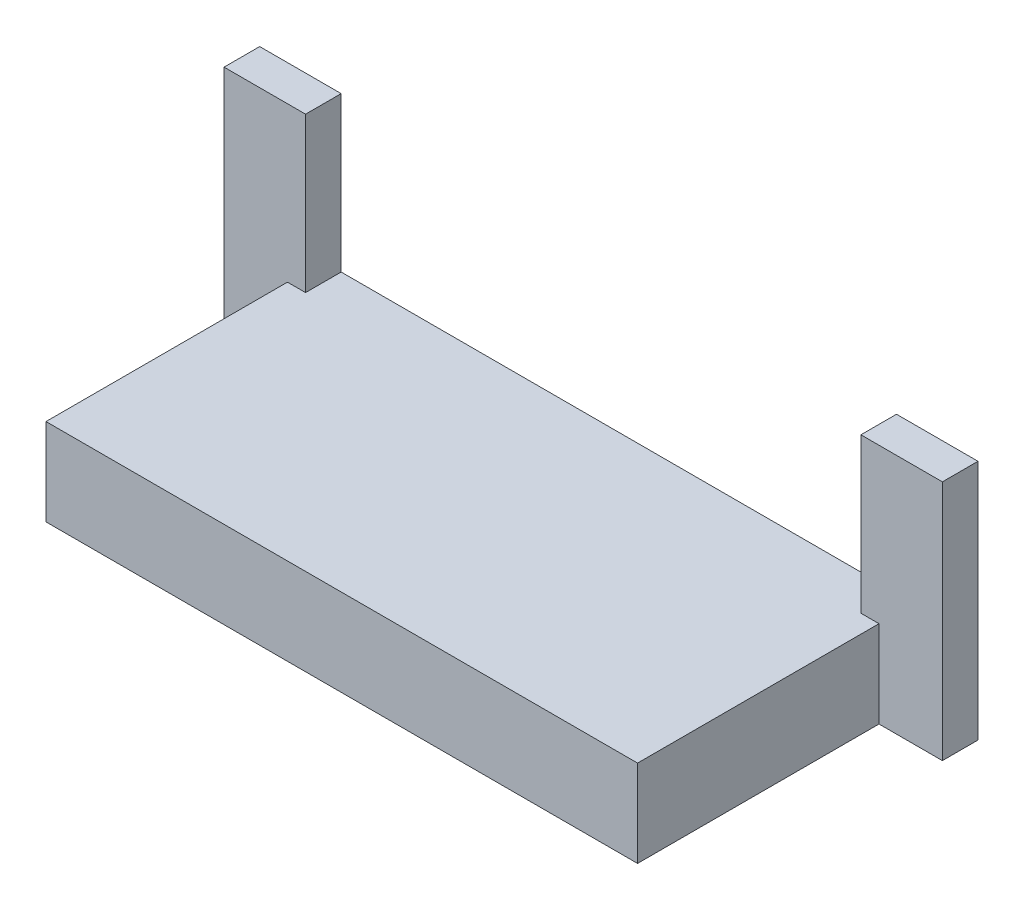
ISO-10303-21;
HEADER;
FILE_DESCRIPTION(('STEP AP214'),'2;1');
FILE_NAME('part.step','',(''),(''),'','','');
FILE_SCHEMA(('AUTOMOTIVE_DESIGN { 1 0 10303 214 1 1 1 1 }'));
ENDSEC;
DATA;
#1=APPLICATION_CONTEXT('core data for automotive mechanical design processes');
#2=APPLICATION_PROTOCOL_DEFINITION('international standard','automotive_design',2000,#1);
#3=PRODUCT_CONTEXT('',#1,'mechanical');
#4=PRODUCT('Part','Part','',(#3));
#5=PRODUCT_RELATED_PRODUCT_CATEGORY('part','',(#4));
#6=PRODUCT_DEFINITION_FORMATION('','',#4);
#7=PRODUCT_DEFINITION_CONTEXT('part definition',#1,'design');
#8=PRODUCT_DEFINITION('design','',#6,#7);
#9=PRODUCT_DEFINITION_SHAPE('','',#8);
#10=(LENGTH_UNIT() NAMED_UNIT(*) SI_UNIT(.MILLI.,.METRE.));
#11=(NAMED_UNIT(*) PLANE_ANGLE_UNIT() SI_UNIT($,.RADIAN.));
#12=(NAMED_UNIT(*) SI_UNIT($,.STERADIAN.) SOLID_ANGLE_UNIT());
#13=UNCERTAINTY_MEASURE_WITH_UNIT(LENGTH_MEASURE(1.E-05),#10,'distance_accuracy_value','');
#14=(GEOMETRIC_REPRESENTATION_CONTEXT(3) GLOBAL_UNCERTAINTY_ASSIGNED_CONTEXT((#13)) GLOBAL_UNIT_ASSIGNED_CONTEXT((#10,
#11,#12)) REPRESENTATION_CONTEXT('',''));
#15=CARTESIAN_POINT('',(0.,0.,0.));
#16=DIRECTION('',(0.,0.,1.));
#17=DIRECTION('',(1.,0.,0.));
#18=AXIS2_PLACEMENT_3D('',#15,#16,#17);
#19=CARTESIAN_POINT('',(0.,0.,1.475));
#20=DIRECTION('',(0.,0.,1.));
#21=DIRECTION('',(1.,0.,0.));
#22=AXIS2_PLACEMENT_3D('',#19,#20,#21);
#23=PLANE('',#22);
#24=DIRECTION('',(0.,-1.,0.));
#25=VECTOR('',#24,1.);
#26=CARTESIAN_POINT('',(-24.5,-2.8,1.475));
#27=LINE('',#26,#25);
#28=CARTESIAN_POINT('',(-24.5,-2.8,1.475));
#29=VERTEX_POINT('',#28);
#30=CARTESIAN_POINT('',(-24.5,-10.,1.475));
#31=VERTEX_POINT('',#30);
#32=EDGE_CURVE('E50',#29,#31,#27,.T.);
#33=ORIENTED_EDGE('',*,*,#32,.F.);
#34=DIRECTION('',(-1.,0.,0.));
#35=VECTOR('',#34,1.);
#36=CARTESIAN_POINT('',(-23.,-2.8,1.475));
#37=LINE('',#36,#35);
#38=CARTESIAN_POINT('',(-23.,-2.8,1.475));
#39=VERTEX_POINT('',#38);
#40=EDGE_CURVE('E11',#39,#29,#37,.T.);
#41=ORIENTED_EDGE('',*,*,#40,.F.);
#42=DIRECTION('',(0.,1.,0.));
#43=VECTOR('',#42,1.);
#44=CARTESIAN_POINT('',(-23.,-2.8,1.475));
#45=LINE('',#44,#43);
#46=CARTESIAN_POINT('',(-23.,10.,1.475));
#47=VERTEX_POINT('',#46);
#48=EDGE_CURVE('E163',#39,#47,#45,.T.);
#49=ORIENTED_EDGE('',*,*,#48,.T.);
#50=DIRECTION('',(-1.,0.,0.));
#51=VECTOR('',#50,1.);
#52=CARTESIAN_POINT('',(-29.75,10.,1.475));
#53=LINE('',#52,#51);
#54=CARTESIAN_POINT('',(-29.75,10.,1.475));
#55=VERTEX_POINT('',#54);
#56=EDGE_CURVE('E165',#47,#55,#53,.T.);
#57=ORIENTED_EDGE('',*,*,#56,.T.);
#58=DIRECTION('',(0.,-1.,0.));
#59=VECTOR('',#58,1.);
#60=CARTESIAN_POINT('',(-29.75,10.,1.475));
#61=LINE('',#60,#59);
#62=CARTESIAN_POINT('',(-29.75,-10.,1.475));
#63=VERTEX_POINT('',#62);
#64=EDGE_CURVE('E167',#55,#63,#61,.T.);
#65=ORIENTED_EDGE('',*,*,#64,.T.);
#66=DIRECTION('',(1.,0.,0.));
#67=VECTOR('',#66,1.);
#68=CARTESIAN_POINT('',(-29.75,-10.,1.475));
#69=LINE('',#68,#67);
#70=EDGE_CURVE('E170',#63,#31,#69,.T.);
#71=ORIENTED_EDGE('',*,*,#70,.T.);
#72=EDGE_LOOP('',(#33,#41,#49,#57,#65,#71));
#73=FACE_BOUND('',#72,.T.);
#74=ADVANCED_FACE('F33',(#73),#23,.T.);
#75=CARTESIAN_POINT('',(29.75,10.,1.475));
#76=DIRECTION('',(-1.,0.,0.));
#77=DIRECTION('',(0.,-1.,0.));
#78=AXIS2_PLACEMENT_3D('',#75,#76,#77);
#79=PLANE('',#78);
#80=DIRECTION('',(0.,1.,0.));
#81=VECTOR('',#80,1.);
#82=CARTESIAN_POINT('',(29.75,10.,-1.475));
#83=LINE('',#82,#81);
#84=CARTESIAN_POINT('',(29.75,-10.,-1.475));
#85=VERTEX_POINT('',#84);
#86=CARTESIAN_POINT('',(29.75,10.,-1.475));
#87=VERTEX_POINT('',#86);
#88=EDGE_CURVE('E146',#85,#87,#83,.T.);
#89=ORIENTED_EDGE('',*,*,#88,.T.);
#90=DIRECTION('',(0.,0.,-1.));
#91=VECTOR('',#90,1.);
#92=CARTESIAN_POINT('',(29.75,10.,1.475));
#93=LINE('',#92,#91);
#94=CARTESIAN_POINT('',(29.75,10.,1.475));
#95=VERTEX_POINT('',#94);
#96=EDGE_CURVE('E37',#95,#87,#93,.T.);
#97=ORIENTED_EDGE('',*,*,#96,.F.);
#98=DIRECTION('',(0.,1.,0.));
#99=VECTOR('',#98,1.);
#100=CARTESIAN_POINT('',(29.75,10.,1.475));
#101=LINE('',#100,#99);
#102=CARTESIAN_POINT('',(29.75,-10.,1.475));
#103=VERTEX_POINT('',#102);
#104=EDGE_CURVE('E155',#103,#95,#101,.T.);
#105=ORIENTED_EDGE('',*,*,#104,.F.);
#106=DIRECTION('',(0.,0.,-1.));
#107=VECTOR('',#106,1.);
#108=CARTESIAN_POINT('',(29.75,-10.,1.475));
#109=LINE('',#108,#107);
#110=EDGE_CURVE('E171',#103,#85,#109,.T.);
#111=ORIENTED_EDGE('',*,*,#110,.T.);
#112=EDGE_LOOP('',(#89,#97,#105,#111));
#113=FACE_BOUND('',#112,.T.);
#114=ADVANCED_FACE('F35',(#113),#79,.F.);
#115=CARTESIAN_POINT('',(23.,10.,1.475));
#116=DIRECTION('',(0.,-1.,0.));
#117=DIRECTION('',(0.,0.,-1.));
#118=AXIS2_PLACEMENT_3D('',#115,#116,#117);
#119=PLANE('',#118);
#120=DIRECTION('',(-1.,0.,0.));
#121=VECTOR('',#120,1.);
#122=CARTESIAN_POINT('',(23.,10.,-1.475));
#123=LINE('',#122,#121);
#124=CARTESIAN_POINT('',(23.,10.,-1.475));
#125=VERTEX_POINT('',#124);
#126=EDGE_CURVE('E149',#87,#125,#123,.T.);
#127=ORIENTED_EDGE('',*,*,#126,.T.);
#128=DIRECTION('',(0.,0.,-1.));
#129=VECTOR('',#128,1.);
#130=CARTESIAN_POINT('',(23.,10.,1.475));
#131=LINE('',#130,#129);
#132=CARTESIAN_POINT('',(23.,10.,1.475));
#133=VERTEX_POINT('',#132);
#134=EDGE_CURVE('E202',#133,#125,#131,.T.);
#135=ORIENTED_EDGE('',*,*,#134,.F.);
#136=DIRECTION('',(-1.,0.,0.));
#137=VECTOR('',#136,1.);
#138=CARTESIAN_POINT('',(23.,10.,1.475));
#139=LINE('',#138,#137);
#140=EDGE_CURVE('E158',#95,#133,#139,.T.);
#141=ORIENTED_EDGE('',*,*,#140,.F.);
#142=ORIENTED_EDGE('',*,*,#96,.T.);
#143=EDGE_LOOP('',(#127,#135,#141,#142));
#144=FACE_BOUND('',#143,.T.);
#145=ADVANCED_FACE('F210',(#144),#119,.F.);
#146=CARTESIAN_POINT('',(23.,-2.8,1.475));
#147=DIRECTION('',(1.,0.,0.));
#148=DIRECTION('',(0.,0.,-1.));
#149=AXIS2_PLACEMENT_3D('',#146,#147,#148);
#150=PLANE('',#149);
#151=DIRECTION('',(0.,-1.,0.));
#152=VECTOR('',#151,1.);
#153=CARTESIAN_POINT('',(23.,-2.8,-1.475));
#154=LINE('',#153,#152);
#155=CARTESIAN_POINT('',(23.,-2.8,-1.475));
#156=VERTEX_POINT('',#155);
#157=EDGE_CURVE('E175',#125,#156,#154,.T.);
#158=ORIENTED_EDGE('',*,*,#157,.T.);
#159=DIRECTION('',(0.,0.,-1.));
#160=VECTOR('',#159,1.);
#161=CARTESIAN_POINT('',(23.,-2.8,1.475));
#162=LINE('',#161,#160);
#163=CARTESIAN_POINT('',(23.,-2.8,1.475));
#164=VERTEX_POINT('',#163);
#165=EDGE_CURVE('E200',#164,#156,#162,.T.);
#166=ORIENTED_EDGE('',*,*,#165,.F.);
#167=DIRECTION('',(0.,-1.,0.));
#168=VECTOR('',#167,1.);
#169=CARTESIAN_POINT('',(23.,10.,1.475));
#170=LINE('',#169,#168);
#171=EDGE_CURVE('E161',#133,#164,#170,.T.);
#172=ORIENTED_EDGE('',*,*,#171,.F.);
#173=ORIENTED_EDGE('',*,*,#134,.T.);
#174=EDGE_LOOP('',(#158,#166,#172,#173));
#175=FACE_BOUND('',#174,.T.);
#176=ADVANCED_FACE('F221',(#175),#150,.F.);
#177=CARTESIAN_POINT('',(-23.,-2.8,1.475));
#178=DIRECTION('',(0.,-1.,0.));
#179=DIRECTION('',(0.,0.,-1.));
#180=AXIS2_PLACEMENT_3D('',#177,#178,#179);
#181=PLANE('',#180);
#182=DIRECTION('',(-1.,0.,0.));
#183=VECTOR('',#182,1.);
#184=CARTESIAN_POINT('',(-23.,-2.8,-1.475));
#185=LINE('',#184,#183);
#186=CARTESIAN_POINT('',(-23.,-2.8,-1.475));
#187=VERTEX_POINT('',#186);
#188=EDGE_CURVE('E177',#156,#187,#185,.T.);
#189=ORIENTED_EDGE('',*,*,#188,.T.);
#190=DIRECTION('',(0.,0.,-1.));
#191=VECTOR('',#190,1.);
#192=CARTESIAN_POINT('',(-23.,-2.8,1.475));
#193=LINE('',#192,#191);
#194=EDGE_CURVE('E197',#39,#187,#193,.T.);
#195=ORIENTED_EDGE('',*,*,#194,.F.);
#196=ORIENTED_EDGE('',*,*,#40,.T.);
#197=DIRECTION('',(0.,0.,-1.));
#198=VECTOR('',#197,1.);
#199=CARTESIAN_POINT('',(-24.5,-2.8,21.475));
#200=LINE('',#199,#198);
#201=CARTESIAN_POINT('',(-24.5,-2.8,21.475));
#202=VERTEX_POINT('',#201);
#203=EDGE_CURVE('E127',#202,#29,#200,.T.);
#204=ORIENTED_EDGE('',*,*,#203,.F.);
#205=DIRECTION('',(-1.,0.,0.));
#206=VECTOR('',#205,1.);
#207=CARTESIAN_POINT('',(-23.,-2.8,21.475));
#208=LINE('',#207,#206);
#209=CARTESIAN_POINT('',(24.5,-2.79999999999999,21.475));
#210=VERTEX_POINT('',#209);
#211=EDGE_CURVE('E133',#210,#202,#208,.T.);
#212=ORIENTED_EDGE('',*,*,#211,.F.);
#213=DIRECTION('',(0.,0.,-1.));
#214=VECTOR('',#213,1.);
#215=CARTESIAN_POINT('',(24.5,-2.79999999999999,21.475));
#216=LINE('',#215,#214);
#217=CARTESIAN_POINT('',(24.5,-2.79999999999999,1.475));
#218=VERTEX_POINT('',#217);
#219=EDGE_CURVE('E223',#210,#218,#216,.T.);
#220=ORIENTED_EDGE('',*,*,#219,.T.);
#221=EDGE_CURVE('E43',#218,#164,#37,.T.);
#222=ORIENTED_EDGE('',*,*,#221,.T.);
#223=ORIENTED_EDGE('',*,*,#165,.T.);
#224=EDGE_LOOP('',(#189,#195,#196,#204,#212,#220,#222,#223));
#225=FACE_BOUND('',#224,.T.);
#226=ADVANCED_FACE('F144',(#225),#181,.F.);
#227=CARTESIAN_POINT('',(-23.,10.,1.475));
#228=DIRECTION('',(-1.,0.,0.));
#229=DIRECTION('',(0.,0.,1.));
#230=AXIS2_PLACEMENT_3D('',#227,#228,#229);
#231=PLANE('',#230);
#232=DIRECTION('',(0.,1.,0.));
#233=VECTOR('',#232,1.);
#234=CARTESIAN_POINT('',(-23.,10.,-1.475));
#235=LINE('',#234,#233);
#236=CARTESIAN_POINT('',(-23.,10.,-1.475));
#237=VERTEX_POINT('',#236);
#238=EDGE_CURVE('E179',#187,#237,#235,.T.);
#239=ORIENTED_EDGE('',*,*,#238,.T.);
#240=DIRECTION('',(0.,0.,-1.));
#241=VECTOR('',#240,1.);
#242=CARTESIAN_POINT('',(-23.,10.,1.475));
#243=LINE('',#242,#241);
#244=EDGE_CURVE('E194',#47,#237,#243,.T.);
#245=ORIENTED_EDGE('',*,*,#244,.F.);
#246=ORIENTED_EDGE('',*,*,#48,.F.);
#247=ORIENTED_EDGE('',*,*,#194,.T.);
#248=EDGE_LOOP('',(#239,#245,#246,#247));
#249=FACE_BOUND('',#248,.T.);
#250=ADVANCED_FACE('F258',(#249),#231,.F.);
#251=CARTESIAN_POINT('',(-29.75,10.,1.475));
#252=DIRECTION('',(0.,-1.,0.));
#253=DIRECTION('',(0.,0.,-1.));
#254=AXIS2_PLACEMENT_3D('',#251,#252,#253);
#255=PLANE('',#254);
#256=DIRECTION('',(-1.,0.,0.));
#257=VECTOR('',#256,1.);
#258=CARTESIAN_POINT('',(-29.75,10.,-1.475));
#259=LINE('',#258,#257);
#260=CARTESIAN_POINT('',(-29.75,10.,-1.475));
#261=VERTEX_POINT('',#260);
#262=EDGE_CURVE('E181',#237,#261,#259,.T.);
#263=ORIENTED_EDGE('',*,*,#262,.T.);
#264=DIRECTION('',(0.,0.,-1.));
#265=VECTOR('',#264,1.);
#266=CARTESIAN_POINT('',(-29.75,10.,1.475));
#267=LINE('',#266,#265);
#268=EDGE_CURVE('E191',#55,#261,#267,.T.);
#269=ORIENTED_EDGE('',*,*,#268,.F.);
#270=ORIENTED_EDGE('',*,*,#56,.F.);
#271=ORIENTED_EDGE('',*,*,#244,.T.);
#272=EDGE_LOOP('',(#263,#269,#270,#271));
#273=FACE_BOUND('',#272,.T.);
#274=ADVANCED_FACE('F261',(#273),#255,.F.);
#275=CARTESIAN_POINT('',(-29.75,10.,1.475));
#276=DIRECTION('',(1.,0.,0.));
#277=DIRECTION('',(0.,1.,0.));
#278=AXIS2_PLACEMENT_3D('',#275,#276,#277);
#279=PLANE('',#278);
#280=DIRECTION('',(0.,-1.,0.));
#281=VECTOR('',#280,1.);
#282=CARTESIAN_POINT('',(-29.75,10.,-1.475));
#283=LINE('',#282,#281);
#284=CARTESIAN_POINT('',(-29.75,-10.,-1.475));
#285=VERTEX_POINT('',#284);
#286=EDGE_CURVE('E183',#261,#285,#283,.T.);
#287=ORIENTED_EDGE('',*,*,#286,.T.);
#288=DIRECTION('',(0.,0.,-1.));
#289=VECTOR('',#288,1.);
#290=CARTESIAN_POINT('',(-29.75,-10.,1.475));
#291=LINE('',#290,#289);
#292=EDGE_CURVE('E188',#63,#285,#291,.T.);
#293=ORIENTED_EDGE('',*,*,#292,.F.);
#294=ORIENTED_EDGE('',*,*,#64,.F.);
#295=ORIENTED_EDGE('',*,*,#268,.T.);
#296=EDGE_LOOP('',(#287,#293,#294,#295));
#297=FACE_BOUND('',#296,.T.);
#298=ADVANCED_FACE('F241',(#297),#279,.F.);
#299=CARTESIAN_POINT('',(-29.75,-10.,1.475));
#300=DIRECTION('',(0.,1.,0.));
#301=DIRECTION('',(0.,0.,1.));
#302=AXIS2_PLACEMENT_3D('',#299,#300,#301);
#303=PLANE('',#302);
#304=DIRECTION('',(1.,0.,0.));
#305=VECTOR('',#304,1.);
#306=CARTESIAN_POINT('',(-29.75,-10.,-1.475));
#307=LINE('',#306,#305);
#308=EDGE_CURVE('E159',#285,#85,#307,.T.);
#309=ORIENTED_EDGE('',*,*,#308,.T.);
#310=ORIENTED_EDGE('',*,*,#110,.F.);
#311=CARTESIAN_POINT('',(24.5,-10.,1.475));
#312=VERTEX_POINT('',#311);
#313=EDGE_CURVE('E169',#312,#103,#69,.T.);
#314=ORIENTED_EDGE('',*,*,#313,.F.);
#315=DIRECTION('',(0.,0.,-1.));
#316=VECTOR('',#315,1.);
#317=CARTESIAN_POINT('',(24.5,-9.99999999999999,21.475));
#318=LINE('',#317,#316);
#319=CARTESIAN_POINT('',(24.5,-9.99999999999999,21.475));
#320=VERTEX_POINT('',#319);
#321=EDGE_CURVE('E151',#320,#312,#318,.T.);
#322=ORIENTED_EDGE('',*,*,#321,.F.);
#323=DIRECTION('',(1.,0.,0.));
#324=VECTOR('',#323,1.);
#325=CARTESIAN_POINT('',(-24.5,-10.,21.475));
#326=LINE('',#325,#324);
#327=CARTESIAN_POINT('',(-24.5,-10.,21.475));
#328=VERTEX_POINT('',#327);
#329=EDGE_CURVE('E132',#328,#320,#326,.T.);
#330=ORIENTED_EDGE('',*,*,#329,.F.);
#331=DIRECTION('',(0.,0.,-1.));
#332=VECTOR('',#331,1.);
#333=CARTESIAN_POINT('',(-24.5,-10.,21.475));
#334=LINE('',#333,#332);
#335=EDGE_CURVE('E129',#328,#31,#334,.T.);
#336=ORIENTED_EDGE('',*,*,#335,.T.);
#337=ORIENTED_EDGE('',*,*,#70,.F.);
#338=ORIENTED_EDGE('',*,*,#292,.T.);
#339=EDGE_LOOP('',(#309,#310,#314,#322,#330,#336,#337,#338));
#340=FACE_BOUND('',#339,.T.);
#341=ADVANCED_FACE('F232',(#340),#303,.F.);
#342=ORIENTED_EDGE('',*,*,#221,.F.);
#343=DIRECTION('',(0.,1.,0.));
#344=VECTOR('',#343,1.);
#345=CARTESIAN_POINT('',(24.5,-2.79999999999999,1.475));
#346=LINE('',#345,#344);
#347=EDGE_CURVE('E57',#312,#218,#346,.T.);
#348=ORIENTED_EDGE('',*,*,#347,.F.);
#349=ORIENTED_EDGE('',*,*,#313,.T.);
#350=ORIENTED_EDGE('',*,*,#104,.T.);
#351=ORIENTED_EDGE('',*,*,#140,.T.);
#352=ORIENTED_EDGE('',*,*,#171,.T.);
#353=EDGE_LOOP('',(#342,#348,#349,#350,#351,#352));
#354=FACE_BOUND('',#353,.T.);
#355=ADVANCED_FACE('F233',(#354),#23,.T.);
#356=CARTESIAN_POINT('',(0.,0.,-1.475));
#357=DIRECTION('',(0.,0.,1.));
#358=DIRECTION('',(1.,0.,0.));
#359=AXIS2_PLACEMENT_3D('',#356,#357,#358);
#360=PLANE('',#359);
#361=ORIENTED_EDGE('',*,*,#88,.F.);
#362=ORIENTED_EDGE('',*,*,#308,.F.);
#363=ORIENTED_EDGE('',*,*,#286,.F.);
#364=ORIENTED_EDGE('',*,*,#262,.F.);
#365=ORIENTED_EDGE('',*,*,#238,.F.);
#366=ORIENTED_EDGE('',*,*,#188,.F.);
#367=ORIENTED_EDGE('',*,*,#157,.F.);
#368=ORIENTED_EDGE('',*,*,#126,.F.);
#369=EDGE_LOOP('',(#361,#362,#363,#364,#365,#366,#367,#368));
#370=FACE_BOUND('',#369,.T.);
#371=ADVANCED_FACE('F217',(#370),#360,.F.);
#372=CARTESIAN_POINT('',(-24.5,-2.8,21.475));
#373=DIRECTION('',(1.,0.,0.));
#374=DIRECTION('',(0.,0.,-1.));
#375=AXIS2_PLACEMENT_3D('',#372,#373,#374);
#376=PLANE('',#375);
#377=ORIENTED_EDGE('',*,*,#32,.T.);
#378=ORIENTED_EDGE('',*,*,#335,.F.);
#379=DIRECTION('',(0.,-1.,0.));
#380=VECTOR('',#379,1.);
#381=CARTESIAN_POINT('',(-24.5,-2.8,21.475));
#382=LINE('',#381,#380);
#383=EDGE_CURVE('E123',#202,#328,#382,.T.);
#384=ORIENTED_EDGE('',*,*,#383,.F.);
#385=ORIENTED_EDGE('',*,*,#203,.T.);
#386=EDGE_LOOP('',(#377,#378,#384,#385));
#387=FACE_BOUND('',#386,.T.);
#388=ADVANCED_FACE('F125',(#387),#376,.F.);
#389=CARTESIAN_POINT('',(24.5,-2.79999999999999,21.475));
#390=DIRECTION('',(-1.,0.,0.));
#391=DIRECTION('',(0.,0.,1.));
#392=AXIS2_PLACEMENT_3D('',#389,#390,#391);
#393=PLANE('',#392);
#394=ORIENTED_EDGE('',*,*,#347,.T.);
#395=ORIENTED_EDGE('',*,*,#219,.F.);
#396=DIRECTION('',(0.,1.,0.));
#397=VECTOR('',#396,1.);
#398=CARTESIAN_POINT('',(24.5,-2.79999999999999,21.475));
#399=LINE('',#398,#397);
#400=EDGE_CURVE('E138',#320,#210,#399,.T.);
#401=ORIENTED_EDGE('',*,*,#400,.F.);
#402=ORIENTED_EDGE('',*,*,#321,.T.);
#403=EDGE_LOOP('',(#394,#395,#401,#402));
#404=FACE_BOUND('',#403,.T.);
#405=ADVANCED_FACE('F230',(#404),#393,.F.);
#406=CARTESIAN_POINT('',(0.,0.,21.475));
#407=DIRECTION('',(0.,0.,1.));
#408=DIRECTION('',(1.,0.,0.));
#409=AXIS2_PLACEMENT_3D('',#406,#407,#408);
#410=PLANE('',#409);
#411=ORIENTED_EDGE('',*,*,#211,.T.);
#412=ORIENTED_EDGE('',*,*,#383,.T.);
#413=ORIENTED_EDGE('',*,*,#329,.T.);
#414=ORIENTED_EDGE('',*,*,#400,.T.);
#415=EDGE_LOOP('',(#411,#412,#413,#414));
#416=FACE_BOUND('',#415,.T.);
#417=ADVANCED_FACE('F136',(#416),#410,.T.);
#418=CLOSED_SHELL('',(#74,#114,#145,#176,#226,#250,#274,#298,#341,#355,#371,#388,#405,#417));
#419=MANIFOLD_SOLID_BREP('B2',#418);
#420=ADVANCED_BREP_SHAPE_REPRESENTATION('',(#18,#419),#14);
#421=SHAPE_DEFINITION_REPRESENTATION(#9,#420);
ENDSEC;
END-ISO-10303-21;
